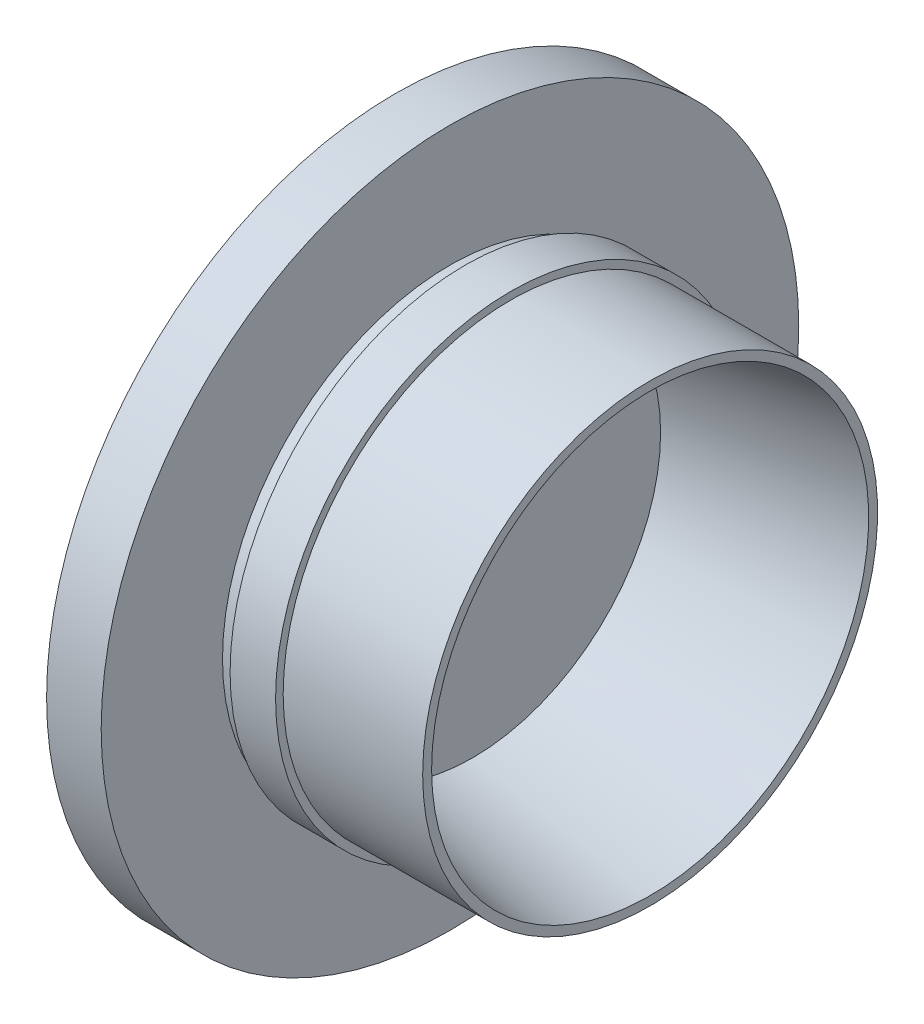
ISO-10303-21;
HEADER;
FILE_DESCRIPTION(('STEP AP214'),'2;1');
FILE_NAME('part.step','',(''),(''),'','','');
FILE_SCHEMA(('AUTOMOTIVE_DESIGN { 1 0 10303 214 1 1 1 1 }'));
ENDSEC;
DATA;
#1=APPLICATION_CONTEXT('core data for automotive mechanical design processes');
#2=APPLICATION_PROTOCOL_DEFINITION('international standard','automotive_design',2000,#1);
#3=PRODUCT_CONTEXT('',#1,'mechanical');
#4=PRODUCT('Part','Part','',(#3));
#5=PRODUCT_RELATED_PRODUCT_CATEGORY('part','',(#4));
#6=PRODUCT_DEFINITION_FORMATION('','',#4);
#7=PRODUCT_DEFINITION_CONTEXT('part definition',#1,'design');
#8=PRODUCT_DEFINITION('design','',#6,#7);
#9=PRODUCT_DEFINITION_SHAPE('','',#8);
#10=(LENGTH_UNIT() NAMED_UNIT(*) SI_UNIT(.MILLI.,.METRE.));
#11=(NAMED_UNIT(*) PLANE_ANGLE_UNIT() SI_UNIT($,.RADIAN.));
#12=(NAMED_UNIT(*) SI_UNIT($,.STERADIAN.) SOLID_ANGLE_UNIT());
#13=UNCERTAINTY_MEASURE_WITH_UNIT(LENGTH_MEASURE(1.E-05),#10,'distance_accuracy_value','');
#14=(GEOMETRIC_REPRESENTATION_CONTEXT(3) GLOBAL_UNCERTAINTY_ASSIGNED_CONTEXT((#13)) GLOBAL_UNIT_ASSIGNED_CONTEXT((#10,
#11,#12)) REPRESENTATION_CONTEXT('',''));
#15=CARTESIAN_POINT('',(0.,0.,0.));
#16=DIRECTION('',(0.,0.,1.));
#17=DIRECTION('',(1.,0.,0.));
#18=AXIS2_PLACEMENT_3D('',#15,#16,#17);
#19=CARTESIAN_POINT('',(1.,0.,0.));
#20=DIRECTION('',(1.,0.,0.));
#21=DIRECTION('',(0.,0.,-1.));
#22=AXIS2_PLACEMENT_3D('',#19,#20,#21);
#23=PLANE('',#22);
#24=CARTESIAN_POINT('',(1.,0.,0.));
#25=DIRECTION('',(-1.,0.,0.));
#26=DIRECTION('',(0.,0.,1.));
#27=AXIS2_PLACEMENT_3D('',#24,#25,#26);
#28=CIRCLE('',#27,30.);
#29=CARTESIAN_POINT('',(1.,0.,30.));
#30=VERTEX_POINT('',#29);
#31=EDGE_CURVE('E72',#30,#30,#28,.T.);
#32=ORIENTED_EDGE('',*,*,#31,.T.);
#33=EDGE_LOOP('',(#32));
#34=FACE_BOUND('',#33,.T.);
#35=ADVANCED_FACE('F32',(#34),#23,.F.);
#36=CARTESIAN_POINT('',(10.2,0.,0.));
#37=DIRECTION('',(1.,0.,0.));
#38=DIRECTION('',(0.,0.,-1.));
#39=AXIS2_PLACEMENT_3D('',#36,#37,#38);
#40=PLANE('',#39);
#41=CARTESIAN_POINT('',(10.2,0.,0.));
#42=DIRECTION('',(-1.,0.,0.));
#43=DIRECTION('',(0.,0.,1.));
#44=AXIS2_PLACEMENT_3D('',#41,#42,#43);
#45=CIRCLE('',#44,24.78);
#46=CARTESIAN_POINT('',(10.2,0.,24.78));
#47=VERTEX_POINT('',#46);
#48=EDGE_CURVE('E10',#47,#47,#45,.T.);
#49=ORIENTED_EDGE('',*,*,#48,.F.);
#50=EDGE_LOOP('',(#49));
#51=FACE_BOUND('',#50,.T.);
#52=ADVANCED_FACE('F89',(#51),#40,.T.);
#53=CARTESIAN_POINT('',(10.2,0.,0.));
#54=DIRECTION('',(1.,0.,0.));
#55=DIRECTION('',(0.,0.,-1.));
#56=AXIS2_PLACEMENT_3D('',#53,#54,#55);
#57=CONICAL_SURFACE('',#56,24.78,0.171072068389931);
#58=CARTESIAN_POINT('',(33.6,0.,0.));
#59=DIRECTION('',(-1.,0.,0.));
#60=DIRECTION('',(0.,0.,1.));
#61=AXIS2_PLACEMENT_3D('',#58,#59,#60);
#62=CIRCLE('',#61,28.8226);
#63=CARTESIAN_POINT('',(33.6,0.,28.8226));
#64=VERTEX_POINT('',#63);
#65=EDGE_CURVE('E38',#64,#64,#62,.T.);
#66=ORIENTED_EDGE('',*,*,#65,.F.);
#67=EDGE_LOOP('',(#66));
#68=FACE_BOUND('',#67,.T.);
#69=ORIENTED_EDGE('',*,*,#48,.T.);
#70=EDGE_LOOP('',(#69));
#71=FACE_BOUND('',#70,.T.);
#72=ADVANCED_FACE('F93',(#68,#71),#57,.F.);
#73=CARTESIAN_POINT('',(33.6,0.,0.));
#74=DIRECTION('',(1.,0.,0.));
#75=DIRECTION('',(0.,0.,-1.));
#76=AXIS2_PLACEMENT_3D('',#73,#74,#75);
#77=PLANE('',#76);
#78=ORIENTED_EDGE('',*,*,#65,.T.);
#79=EDGE_LOOP('',(#78));
#80=FACE_BOUND('',#79,.T.);
#81=CARTESIAN_POINT('',(33.6,0.,0.));
#82=DIRECTION('',(-1.,0.,0.));
#83=DIRECTION('',(0.,0.,1.));
#84=AXIS2_PLACEMENT_3D('',#81,#82,#83);
#85=CIRCLE('',#84,30.);
#86=CARTESIAN_POINT('',(33.6,0.,30.));
#87=VERTEX_POINT('',#86);
#88=EDGE_CURVE('E42',#87,#87,#85,.T.);
#89=ORIENTED_EDGE('',*,*,#88,.F.);
#90=EDGE_LOOP('',(#89));
#91=FACE_BOUND('',#90,.T.);
#92=ADVANCED_FACE('F98',(#80,#91),#77,.T.);
#93=CARTESIAN_POINT('',(0.,0.,0.));
#94=DIRECTION('',(-1.,0.,0.));
#95=DIRECTION('',(0.,0.,1.));
#96=AXIS2_PLACEMENT_3D('',#93,#94,#95);
#97=CYLINDRICAL_SURFACE('',#96,30.);
#98=ORIENTED_EDGE('',*,*,#88,.T.);
#99=EDGE_LOOP('',(#98));
#100=FACE_BOUND('',#99,.T.);
#101=CARTESIAN_POINT('',(15.2,0.,0.));
#102=DIRECTION('',(-1.,0.,0.));
#103=DIRECTION('',(0.,0.,1.));
#104=AXIS2_PLACEMENT_3D('',#101,#102,#103);
#105=CIRCLE('',#104,30.);
#106=CARTESIAN_POINT('',(15.2,0.,30.));
#107=VERTEX_POINT('',#106);
#108=EDGE_CURVE('E46',#107,#107,#105,.T.);
#109=ORIENTED_EDGE('',*,*,#108,.F.);
#110=EDGE_LOOP('',(#109));
#111=FACE_BOUND('',#110,.T.);
#112=ADVANCED_FACE('F104',(#100,#111),#97,.T.);
#113=CARTESIAN_POINT('',(15.2,0.,0.));
#114=DIRECTION('',(1.,0.,0.));
#115=DIRECTION('',(0.,0.,-1.));
#116=AXIS2_PLACEMENT_3D('',#113,#114,#115);
#117=PLANE('',#116);
#118=ORIENTED_EDGE('',*,*,#108,.T.);
#119=EDGE_LOOP('',(#118));
#120=FACE_BOUND('',#119,.T.);
#121=CARTESIAN_POINT('',(15.2,0.,0.));
#122=DIRECTION('',(-1.,0.,0.));
#123=DIRECTION('',(0.,0.,1.));
#124=AXIS2_PLACEMENT_3D('',#121,#122,#123);
#125=CIRCLE('',#124,31.);
#126=CARTESIAN_POINT('',(15.2,0.,31.));
#127=VERTEX_POINT('',#126);
#128=EDGE_CURVE('E51',#127,#127,#125,.T.);
#129=ORIENTED_EDGE('',*,*,#128,.F.);
#130=EDGE_LOOP('',(#129));
#131=FACE_BOUND('',#130,.T.);
#132=ADVANCED_FACE('F107',(#120,#131),#117,.T.);
#133=CARTESIAN_POINT('',(0.,0.,0.));
#134=DIRECTION('',(-1.,0.,0.));
#135=DIRECTION('',(0.,0.,1.));
#136=AXIS2_PLACEMENT_3D('',#133,#134,#135);
#137=CYLINDRICAL_SURFACE('',#136,31.);
#138=ORIENTED_EDGE('',*,*,#128,.T.);
#139=EDGE_LOOP('',(#138));
#140=FACE_BOUND('',#139,.T.);
#141=CARTESIAN_POINT('',(9.2,0.,0.));
#142=DIRECTION('',(-1.,0.,0.));
#143=DIRECTION('',(0.,0.,1.));
#144=AXIS2_PLACEMENT_3D('',#141,#142,#143);
#145=CIRCLE('',#144,31.);
#146=CARTESIAN_POINT('',(9.2,0.,31.));
#147=VERTEX_POINT('',#146);
#148=EDGE_CURVE('E54',#147,#147,#145,.T.);
#149=ORIENTED_EDGE('',*,*,#148,.F.);
#150=EDGE_LOOP('',(#149));
#151=FACE_BOUND('',#150,.T.);
#152=ADVANCED_FACE('F111',(#140,#151),#137,.T.);
#153=CARTESIAN_POINT('',(9.2,0.,0.));
#154=DIRECTION('',(-1.,0.,0.));
#155=DIRECTION('',(0.,0.,1.));
#156=AXIS2_PLACEMENT_3D('',#153,#154,#155);
#157=PLANE('',#156);
#158=ORIENTED_EDGE('',*,*,#148,.T.);
#159=EDGE_LOOP('',(#158));
#160=FACE_BOUND('',#159,.T.);
#161=CARTESIAN_POINT('',(9.2,0.,0.));
#162=DIRECTION('',(-1.,0.,0.));
#163=DIRECTION('',(0.,0.,1.));
#164=AXIS2_PLACEMENT_3D('',#161,#162,#163);
#165=CIRCLE('',#164,30.);
#166=CARTESIAN_POINT('',(9.2,0.,30.));
#167=VERTEX_POINT('',#166);
#168=EDGE_CURVE('E57',#167,#167,#165,.T.);
#169=ORIENTED_EDGE('',*,*,#168,.F.);
#170=EDGE_LOOP('',(#169));
#171=FACE_BOUND('',#170,.T.);
#172=ADVANCED_FACE('F115',(#160,#171),#157,.T.);
#173=CARTESIAN_POINT('',(0.,0.,0.));
#174=DIRECTION('',(-1.,0.,0.));
#175=DIRECTION('',(0.,0.,1.));
#176=AXIS2_PLACEMENT_3D('',#173,#174,#175);
#177=CYLINDRICAL_SURFACE('',#176,30.);
#178=ORIENTED_EDGE('',*,*,#168,.T.);
#179=EDGE_LOOP('',(#178));
#180=FACE_BOUND('',#179,.T.);
#181=CARTESIAN_POINT('',(7.2,0.,0.));
#182=DIRECTION('',(-1.,0.,0.));
#183=DIRECTION('',(0.,0.,1.));
#184=AXIS2_PLACEMENT_3D('',#181,#182,#183);
#185=CIRCLE('',#184,30.);
#186=CARTESIAN_POINT('',(7.2,0.,30.));
#187=VERTEX_POINT('',#186);
#188=EDGE_CURVE('E60',#187,#187,#185,.T.);
#189=ORIENTED_EDGE('',*,*,#188,.F.);
#190=EDGE_LOOP('',(#189));
#191=FACE_BOUND('',#190,.T.);
#192=ADVANCED_FACE('F119',(#180,#191),#177,.T.);
#193=CARTESIAN_POINT('',(7.2,0.,0.));
#194=DIRECTION('',(1.,0.,0.));
#195=DIRECTION('',(0.,0.,-1.));
#196=AXIS2_PLACEMENT_3D('',#193,#194,#195);
#197=PLANE('',#196);
#198=ORIENTED_EDGE('',*,*,#188,.T.);
#199=EDGE_LOOP('',(#198));
#200=FACE_BOUND('',#199,.T.);
#201=CARTESIAN_POINT('',(7.2,0.,0.));
#202=DIRECTION('',(-1.,0.,0.));
#203=DIRECTION('',(0.,0.,1.));
#204=AXIS2_PLACEMENT_3D('',#201,#202,#203);
#205=CIRCLE('',#204,46.);
#206=CARTESIAN_POINT('',(7.2,0.,46.));
#207=VERTEX_POINT('',#206);
#208=EDGE_CURVE('E63',#207,#207,#205,.T.);
#209=ORIENTED_EDGE('',*,*,#208,.F.);
#210=EDGE_LOOP('',(#209));
#211=FACE_BOUND('',#210,.T.);
#212=ADVANCED_FACE('F123',(#200,#211),#197,.T.);
#213=CARTESIAN_POINT('',(0.,0.,0.));
#214=DIRECTION('',(-1.,0.,0.));
#215=DIRECTION('',(0.,0.,1.));
#216=AXIS2_PLACEMENT_3D('',#213,#214,#215);
#217=CYLINDRICAL_SURFACE('',#216,46.);
#218=ORIENTED_EDGE('',*,*,#208,.T.);
#219=EDGE_LOOP('',(#218));
#220=FACE_BOUND('',#219,.T.);
#221=CARTESIAN_POINT('',(0.,0.,0.));
#222=DIRECTION('',(-1.,0.,0.));
#223=DIRECTION('',(0.,0.,1.));
#224=AXIS2_PLACEMENT_3D('',#221,#222,#223);
#225=CIRCLE('',#224,46.);
#226=CARTESIAN_POINT('',(0.,0.,46.));
#227=VERTEX_POINT('',#226);
#228=EDGE_CURVE('E66',#227,#227,#225,.T.);
#229=ORIENTED_EDGE('',*,*,#228,.F.);
#230=EDGE_LOOP('',(#229));
#231=FACE_BOUND('',#230,.T.);
#232=ADVANCED_FACE('F85',(#220,#231),#217,.T.);
#233=CARTESIAN_POINT('',(0.,0.,0.));
#234=DIRECTION('',(-1.,0.,0.));
#235=DIRECTION('',(0.,0.,1.));
#236=AXIS2_PLACEMENT_3D('',#233,#234,#235);
#237=PLANE('',#236);
#238=ORIENTED_EDGE('',*,*,#228,.T.);
#239=EDGE_LOOP('',(#238));
#240=FACE_BOUND('',#239,.T.);
#241=CARTESIAN_POINT('',(0.,0.,0.));
#242=DIRECTION('',(-1.,0.,0.));
#243=DIRECTION('',(0.,0.,1.));
#244=AXIS2_PLACEMENT_3D('',#241,#242,#243);
#245=CIRCLE('',#244,30.);
#246=CARTESIAN_POINT('',(0.,0.,30.));
#247=VERTEX_POINT('',#246);
#248=EDGE_CURVE('E69',#247,#247,#245,.T.);
#249=ORIENTED_EDGE('',*,*,#248,.F.);
#250=EDGE_LOOP('',(#249));
#251=FACE_BOUND('',#250,.T.);
#252=ADVANCED_FACE('F79',(#240,#251),#237,.T.);
#253=CARTESIAN_POINT('',(0.,0.,0.));
#254=DIRECTION('',(-1.,0.,0.));
#255=DIRECTION('',(0.,0.,1.));
#256=AXIS2_PLACEMENT_3D('',#253,#254,#255);
#257=CYLINDRICAL_SURFACE('',#256,30.);
#258=ORIENTED_EDGE('',*,*,#248,.T.);
#259=EDGE_LOOP('',(#258));
#260=FACE_BOUND('',#259,.T.);
#261=ORIENTED_EDGE('',*,*,#31,.F.);
#262=EDGE_LOOP('',(#261));
#263=FACE_BOUND('',#262,.T.);
#264=ADVANCED_FACE('F77',(#260,#263),#257,.F.);
#265=CLOSED_SHELL('',(#35,#52,#72,#92,#112,#132,#152,#172,#192,#212,#232,#252,#264));
#266=MANIFOLD_SOLID_BREP('B2',#265);
#267=ADVANCED_BREP_SHAPE_REPRESENTATION('',(#18,#266),#14);
#268=SHAPE_DEFINITION_REPRESENTATION(#9,#267);
ENDSEC;
END-ISO-10303-21;
